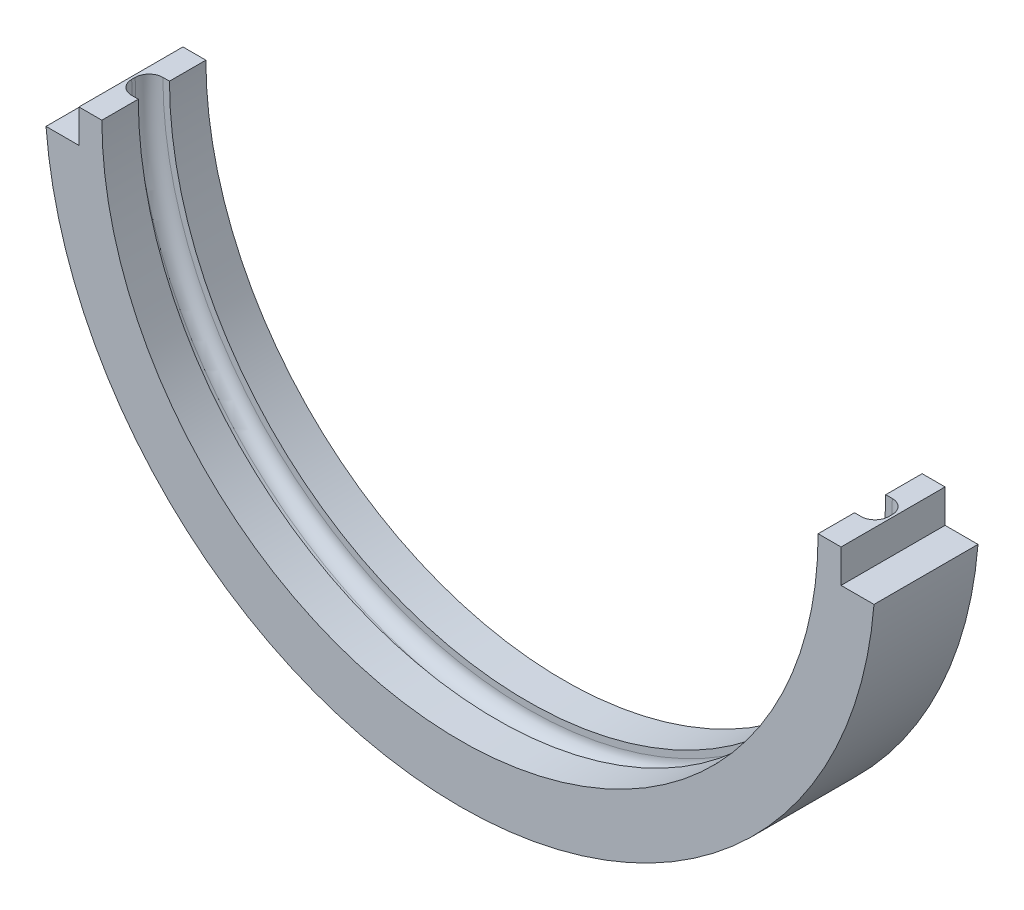
ISO-10303-21;
HEADER;
FILE_DESCRIPTION(('STEP AP214'),'2;1');
FILE_NAME('part.step','',(''),(''),'','','');
FILE_SCHEMA(('AUTOMOTIVE_DESIGN { 1 0 10303 214 1 1 1 1 }'));
ENDSEC;
DATA;
#1=APPLICATION_CONTEXT('core data for automotive mechanical design processes');
#2=APPLICATION_PROTOCOL_DEFINITION('international standard','automotive_design',2000,#1);
#3=PRODUCT_CONTEXT('',#1,'mechanical');
#4=PRODUCT('Part','Part','',(#3));
#5=PRODUCT_RELATED_PRODUCT_CATEGORY('part','',(#4));
#6=PRODUCT_DEFINITION_FORMATION('','',#4);
#7=PRODUCT_DEFINITION_CONTEXT('part definition',#1,'design');
#8=PRODUCT_DEFINITION('design','',#6,#7);
#9=PRODUCT_DEFINITION_SHAPE('','',#8);
#10=(LENGTH_UNIT() NAMED_UNIT(*) SI_UNIT(.MILLI.,.METRE.));
#11=(NAMED_UNIT(*) PLANE_ANGLE_UNIT() SI_UNIT($,.RADIAN.));
#12=(NAMED_UNIT(*) SI_UNIT($,.STERADIAN.) SOLID_ANGLE_UNIT());
#13=UNCERTAINTY_MEASURE_WITH_UNIT(LENGTH_MEASURE(1.E-05),#10,'distance_accuracy_value','');
#14=(GEOMETRIC_REPRESENTATION_CONTEXT(3) GLOBAL_UNCERTAINTY_ASSIGNED_CONTEXT((#13)) GLOBAL_UNIT_ASSIGNED_CONTEXT((#10,
#11,#12)) REPRESENTATION_CONTEXT('',''));
#15=CARTESIAN_POINT('',(0.,0.,0.));
#16=DIRECTION('',(0.,0.,1.));
#17=DIRECTION('',(1.,0.,0.));
#18=AXIS2_PLACEMENT_3D('',#15,#16,#17);
#19=CARTESIAN_POINT('',(0.,76.073,5.715));
#20=DIRECTION('',(0.,0.,-1.));
#21=DIRECTION('',(-1.,0.,0.));
#22=AXIS2_PLACEMENT_3D('',#19,#20,#21);
#23=CYLINDRICAL_SURFACE('',#22,76.073);
#24=CARTESIAN_POINT('',(0.,0.,1.33349999999999));
#25=CARTESIAN_POINT('',(0.0855945349997394,2.06101865915867E-07,1.33350379291589));
#26=CARTESIAN_POINT('',(0.171250915498614,0.000146012248360919,1.34073524768457));
#27=CARTESIAN_POINT('',(0.340204023150751,0.00071364506222568,1.36948225182749));
#28=CARTESIAN_POINT('',(0.423497794593289,0.00113580282824444,1.39101493604841));
#29=CARTESIAN_POINT('',(0.58525356893735,0.00220832220925467,1.44775060002442));
#30=CARTESIAN_POINT('',(0.663717883442069,0.00285857363366933,1.48294697981084));
#31=CARTESIAN_POINT('',(0.813602096244806,0.0043138981059449,1.56600169332678));
#32=CARTESIAN_POINT('',(0.885023725956289,0.00511893295668781,1.61385690423012));
#33=CARTESIAN_POINT('',(1.01883757249064,0.00679340697851409,1.72088761442366));
#34=CARTESIAN_POINT('',(1.08122770917481,0.00766286091714674,1.78006571434437));
#35=CARTESIAN_POINT('',(1.19519031708527,0.0093680471323975,1.90805861859076));
#36=CARTESIAN_POINT('',(1.24676236082598,0.010203778075371,1.97687380355443));
#37=CARTESIAN_POINT('',(1.3376251451231,0.0117473104519163,2.12219141461824));
#38=CARTESIAN_POINT('',(1.37691508154246,0.0124551035078293,2.19869434361906));
#39=CARTESIAN_POINT('',(1.44209293399731,0.0136628632197349,2.35721212766005));
#40=CARTESIAN_POINT('',(1.46798088892473,0.0141628304788274,2.43922696670414));
#41=CARTESIAN_POINT('',(1.50561666142446,0.0148984887564408,2.60642887018513));
#42=CARTESIAN_POINT('',(1.51736637556974,0.0151342152212277,2.69161550756052));
#43=CARTESIAN_POINT('',(1.52639796106279,0.0153149207245114,2.8627524189173));
#44=CARTESIAN_POINT('',(1.52367987260578,0.0152599005707755,2.94870269077645));
#45=CARTESIAN_POINT('',(1.50385466040848,0.0148653504340099,3.11891417148759));
#46=CARTESIAN_POINT('',(1.48674959902126,0.0145258612292591,3.20317562065764));
#47=CARTESIAN_POINT('',(1.43863917290202,0.0136007098296155,3.3676307436008));
#48=CARTESIAN_POINT('',(1.40763378638577,0.0130150472489263,3.44782441099877));
#49=CARTESIAN_POINT('',(1.33260048235792,0.0116635275432489,3.60187411392825));
#50=CARTESIAN_POINT('',(1.28857161888797,0.0108976573297322,3.67572968859041));
#51=CARTESIAN_POINT('',(1.18874191287519,0.00927207813996294,3.81500161578621));
#52=CARTESIAN_POINT('',(1.13294106097371,0.00841236908910922,3.88041796161065));
#53=CARTESIAN_POINT('',(1.01113968026977,0.00669585093085855,4.00096653225274));
#54=CARTESIAN_POINT('',(0.945137359360457,0.0058390423600706,4.05609694636289));
#55=CARTESIAN_POINT('',(0.804812955805773,0.00422506510297776,4.15449474589157));
#56=CARTESIAN_POINT('',(0.730490871968146,0.00346789643095172,4.19776212961007));
#57=CARTESIAN_POINT('',(0.575635722257035,0.00213855432188997,4.27120543008588));
#58=CARTESIAN_POINT('',(0.495102630444092,0.00156638165751761,4.30138129216468));
#59=CARTESIAN_POINT('',(0.330111987568197,0.000671548269268094,4.34778380786271));
#60=CARTESIAN_POINT('',(0.245654441366153,0.000348887236349569,4.3640104787592));
#61=CARTESIAN_POINT('',(0.0752280970382326,-1.05092405947312E-05,4.38205177674906));
#62=CARTESIAN_POINT('',(-0.0107404358431765,-4.72943757394238E-05,4.38386890851823));
#63=CARTESIAN_POINT('',(-0.181762198594427,0.000169076345192388,4.37304606986865));
#64=CARTESIAN_POINT('',(-0.266815428914038,0.000422232058788883,4.36040610655427));
#65=CARTESIAN_POINT('',(-0.433585227687398,0.0011899157446135,4.32102995718912));
#66=CARTESIAN_POINT('',(-0.515302064212906,0.00170442267303155,4.29429490605803));
#67=CARTESIAN_POINT('',(-0.673087615387558,0.00293681524962359,4.22748865692274));
#68=CARTESIAN_POINT('',(-0.749156325373015,0.00365470106572617,4.18741744790695));
#69=CARTESIAN_POINT('',(-0.893497817923817,0.00521306827912535,4.09506991635602));
#70=CARTESIAN_POINT('',(-0.961769521065522,0.00605356661440183,4.04279190694471));
#71=CARTESIAN_POINT('',(-1.08856816644544,0.00776235857443175,3.92751724418561));
#72=CARTESIAN_POINT('',(-1.14709509541133,0.00863065223704034,3.86452057623931));
#73=CARTESIAN_POINT('',(-1.25275113682792,0.0102972860680389,3.72958614285633));
#74=CARTESIAN_POINT('',(-1.2998786325906,0.0110956163038644,3.65764711138529));
#75=CARTESIAN_POINT('',(-1.38138693581098,0.012532160014725,3.50687658683567));
#76=CARTESIAN_POINT('',(-1.41576776354565,0.0131703737444674,3.4280451047216));
#77=CARTESIAN_POINT('',(-1.47080396987324,0.0142146587671107,3.26573353617285));
#78=CARTESIAN_POINT('',(-1.49146040078931,0.0146207478579197,3.18225380667632));
#79=CARTESIAN_POINT('',(-1.51846491163559,0.015155049642882,3.01301030152232));
#80=CARTESIAN_POINT('',(-1.52481298287515,0.0152832621682579,2.92724652447759));
#81=CARTESIAN_POINT('',(-1.5230204201675,0.0152473484650301,2.75588581915875));
#82=CARTESIAN_POINT('',(-1.51488234856612,0.0150832739369008,2.67028886405773));
#83=CARTESIAN_POINT('',(-1.4843537508379,0.0144813917127718,2.50167631198362));
#84=CARTESIAN_POINT('',(-1.46196319621411,0.0140435834694591,2.41866072017216));
#85=CARTESIAN_POINT('',(-1.40356528137836,0.0129435925449101,2.25756570290613));
#86=CARTESIAN_POINT('',(-1.36755767518963,0.0122814058105504,2.17948636664921));
#87=CARTESIAN_POINT('',(-1.28294952090296,0.0108073427394373,2.03048353282782));
#88=CARTESIAN_POINT('',(-1.23434944982934,0.00999547207330576,1.95955976433944));
#89=CARTESIAN_POINT('',(-1.12593166801518,0.00831346202115557,1.82687158382607));
#90=CARTESIAN_POINT('',(-1.06611316687766,0.00744331853229102,1.76510781772051));
#91=CARTESIAN_POINT('',(-0.936938606354715,0.00574266821983038,1.65248329537931));
#92=CARTESIAN_POINT('',(-0.867580184106196,0.00491217128481854,1.60162524830068));
#93=CARTESIAN_POINT('',(-0.721275855637611,0.00338424251398353,1.51225182287018));
#94=CARTESIAN_POINT('',(-0.644325772223447,0.00268688456219293,1.47374328973678));
#95=CARTESIAN_POINT('',(-0.485111216277927,0.00150529078577328,1.41023637854843));
#96=CARTESIAN_POINT('',(-0.402853232344317,0.00102080019868899,1.38522184248434));
#97=CARTESIAN_POINT('',(-0.266727553014035,0.00044943552346389,1.35606306091305));
#98=CARTESIAN_POINT('',(-0.213743956090708,0.000281625570785505,1.34761251136189));
#99=CARTESIAN_POINT('',(-0.10718165758212,5.68432813400188E-05,1.33632979362654));
#100=CARTESIAN_POINT('',(-0.0536029560740152,-1.29069797102052E-07,1.33349762471394));
#101=CARTESIAN_POINT('',(0.,0.,1.33349999999999));
#102=B_SPLINE_CURVE_WITH_KNOTS('',3,(#24,#25,#26,#27,#28,#29,#30,#31,#32,#33,#34,#35,#36,#37,
#38,#39,#40,#41,#42,#43,#44,#45,#46,#47,#48,#49,#50,#51,#52,#53,#54,#55,#56,#57,#58,#59,#60,#61,
#62,#63,#64,#65,#66,#67,#68,#69,#70,#71,#72,#73,#74,#75,#76,#77,#78,#79,#80,#81,#82,#83,#84,#85,
#86,#87,#88,#89,#90,#91,#92,#93,#94,#95,#96,#97,#98,#99,#100,#101),.UNSPECIFIED.,.T.,.F.,(4,2,2,
2,2,2,2,2,2,2,2,2,2,2,2,2,2,2,2,2,2,2,2,2,2,2,2,2,2,2,2,2,2,2,2,2,2,2,4),(0.,0.256587951195914,
0.513483886104433,0.770255886772825,1.02696460294593,1.28373235066598,1.5405102428578,
1.79730494335351,2.0540988986388,2.31085840248152,2.56761719298187,2.82433918372928,
3.08106157680606,3.33780262145724,3.59454387021671,3.85133027245316,4.10811671148822,
4.36490422301619,4.62169141649049,4.87843397406325,5.13517640547004,5.3918981674388,
5.64862014138162,5.90537761313974,6.16213543459716,6.41892964858623,6.67572345407407,
6.9324975675299,7.18927183694585,7.44600069198828,7.70273006034533,7.95946406645213,
8.21618834845273,8.47293072481965,8.72973680644864,8.98668498820558,9.2433248077216,
9.40401117000277,9.56469751145107),.UNSPECIFIED.);
#103=CARTESIAN_POINT('',(0.,0.,1.33349999999999));
#104=VERTEX_POINT('',#103);
#105=EDGE_CURVE('E234',#104,#104,#102,.T.);
#106=ORIENTED_EDGE('',*,*,#105,.F.);
#107=EDGE_LOOP('',(#106));
#108=FACE_BOUND('',#107,.T.);
#109=DIRECTION('',(0.,0.,1.));
#110=VECTOR('',#109,1.);
#111=CARTESIAN_POINT('',(-75.8283595563032,69.9769999999999,-6.6675));
#112=LINE('',#111,#110);
#113=CARTESIAN_POINT('',(-75.8283595563032,69.9769999999999,-6.6675));
#114=VERTEX_POINT('',#113);
#115=CARTESIAN_POINT('',(-75.8283595563032,69.9769999999999,12.3825));
#116=VERTEX_POINT('',#115);
#117=EDGE_CURVE('E12',#114,#116,#112,.T.);
#118=ORIENTED_EDGE('',*,*,#117,.F.);
#119=CARTESIAN_POINT('',(0.,76.073,-6.6675));
#120=DIRECTION('',(0.,0.,-1.));
#121=DIRECTION('',(-1.,0.,0.));
#122=AXIS2_PLACEMENT_3D('',#119,#120,#121);
#123=CIRCLE('',#122,76.073);
#124=CARTESIAN_POINT('',(75.8283595563032,69.977,-6.6675));
#125=VERTEX_POINT('',#124);
#126=EDGE_CURVE('E303',#125,#114,#123,.T.);
#127=ORIENTED_EDGE('',*,*,#126,.F.);
#128=DIRECTION('',(0.,0.,-1.));
#129=VECTOR('',#128,1.);
#130=CARTESIAN_POINT('',(75.8283595563032,69.977,5.715));
#131=LINE('',#130,#129);
#132=CARTESIAN_POINT('',(75.8283595563032,69.977,12.3825));
#133=VERTEX_POINT('',#132);
#134=EDGE_CURVE('E202',#125,#133,#131,.F.);
#135=ORIENTED_EDGE('',*,*,#134,.T.);
#136=CARTESIAN_POINT('',(0.,76.073,12.3825));
#137=DIRECTION('',(0.,0.,1.));
#138=DIRECTION('',(1.,0.,0.));
#139=AXIS2_PLACEMENT_3D('',#136,#137,#138);
#140=CIRCLE('',#139,76.073);
#141=EDGE_CURVE('E305',#116,#133,#140,.T.);
#142=ORIENTED_EDGE('',*,*,#141,.F.);
#143=EDGE_LOOP('',(#118,#127,#135,#142));
#144=FACE_BOUND('',#143,.T.);
#145=ADVANCED_FACE('F90',(#108,#144),#23,.T.);
#146=CARTESIAN_POINT('',(0.,76.073,5.715));
#147=DIRECTION('',(0.,-1.,0.));
#148=DIRECTION('',(0.,0.,-1.));
#149=AXIS2_PLACEMENT_3D('',#146,#147,#148);
#150=PLANE('',#149);
#151=DIRECTION('',(0.,0.,1.));
#152=VECTOR('',#151,1.);
#153=CARTESIAN_POINT('',(-69.7958595563032,76.073,-6.6675));
#154=LINE('',#153,#152);
#155=CARTESIAN_POINT('',(-69.7958595563032,76.073,-6.6675));
#156=VERTEX_POINT('',#155);
#157=CARTESIAN_POINT('',(-69.7958595563032,76.073,12.3825));
#158=VERTEX_POINT('',#157);
#159=EDGE_CURVE('E191',#156,#158,#154,.T.);
#160=ORIENTED_EDGE('',*,*,#159,.T.);
#161=DIRECTION('',(-1.,0.,0.));
#162=VECTOR('',#161,1.);
#163=CARTESIAN_POINT('',(0.,76.073,12.3825));
#164=LINE('',#163,#162);
#165=CARTESIAN_POINT('',(-65.5955,76.073,12.3825));
#166=VERTEX_POINT('',#165);
#167=EDGE_CURVE('E218',#166,#158,#164,.T.);
#168=ORIENTED_EDGE('',*,*,#167,.F.);
#169=DIRECTION('',(0.,0.,-1.));
#170=VECTOR('',#169,1.);
#171=CARTESIAN_POINT('',(-65.5955,76.073,12.3825));
#172=LINE('',#171,#170);
#173=CARTESIAN_POINT('',(-65.5955,76.073,5.715));
#174=VERTEX_POINT('',#173);
#175=EDGE_CURVE('E201',#166,#174,#172,.T.);
#176=ORIENTED_EDGE('',*,*,#175,.T.);
#177=DIRECTION('',(-1.,0.,0.));
#178=VECTOR('',#177,1.);
#179=CARTESIAN_POINT('',(0.,76.073,5.715));
#180=LINE('',#179,#178);
#181=CARTESIAN_POINT('',(-66.802,76.073,5.715));
#182=VERTEX_POINT('',#181);
#183=EDGE_CURVE('E342',#174,#182,#180,.T.);
#184=ORIENTED_EDGE('',*,*,#183,.T.);
#185=CARTESIAN_POINT('',(-66.802,76.073,3.175));
#186=DIRECTION('',(0.,-1.,0.));
#187=DIRECTION('',(0.,0.,-1.));
#188=AXIS2_PLACEMENT_3D('',#185,#186,#187);
#189=CIRCLE('',#188,2.54);
#190=CARTESIAN_POINT('',(-69.342,76.073,3.175));
#191=VERTEX_POINT('',#190);
#192=EDGE_CURVE('E228',#182,#191,#189,.T.);
#193=ORIENTED_EDGE('',*,*,#192,.T.);
#194=DIRECTION('',(0.,0.,-1.));
#195=VECTOR('',#194,1.);
#196=CARTESIAN_POINT('',(-69.342,76.073,5.715));
#197=LINE('',#196,#195);
#198=CARTESIAN_POINT('',(-69.342,76.073,2.54));
#199=VERTEX_POINT('',#198);
#200=EDGE_CURVE('E222',#191,#199,#197,.T.);
#201=ORIENTED_EDGE('',*,*,#200,.T.);
#202=CARTESIAN_POINT('',(-66.802,76.073,2.54));
#203=DIRECTION('',(0.,-1.,0.));
#204=DIRECTION('',(0.,0.,-1.));
#205=AXIS2_PLACEMENT_3D('',#202,#203,#204);
#206=CIRCLE('',#205,2.54);
#207=CARTESIAN_POINT('',(-66.802,76.073,0.));
#208=VERTEX_POINT('',#207);
#209=EDGE_CURVE('E219',#199,#208,#206,.T.);
#210=ORIENTED_EDGE('',*,*,#209,.T.);
#211=DIRECTION('',(-1.,0.,0.));
#212=VECTOR('',#211,1.);
#213=CARTESIAN_POINT('',(0.,76.073,0.));
#214=LINE('',#213,#212);
#215=CARTESIAN_POINT('',(-65.5955,76.073,0.));
#216=VERTEX_POINT('',#215);
#217=EDGE_CURVE('E369',#216,#208,#214,.T.);
#218=ORIENTED_EDGE('',*,*,#217,.F.);
#219=DIRECTION('',(0.,0.,1.));
#220=VECTOR('',#219,1.);
#221=CARTESIAN_POINT('',(-65.5955,76.073,-6.6675));
#222=LINE('',#221,#220);
#223=CARTESIAN_POINT('',(-65.5955,76.073,-6.6675));
#224=VERTEX_POINT('',#223);
#225=EDGE_CURVE('E215',#224,#216,#222,.T.);
#226=ORIENTED_EDGE('',*,*,#225,.F.);
#227=DIRECTION('',(-1.,0.,0.));
#228=VECTOR('',#227,1.);
#229=CARTESIAN_POINT('',(0.,76.073,-6.6675));
#230=LINE('',#229,#228);
#231=EDGE_CURVE('E94',#224,#156,#230,.T.);
#232=ORIENTED_EDGE('',*,*,#231,.T.);
#233=EDGE_LOOP('',(#160,#168,#176,#184,#193,#201,#210,#218,#226,#232));
#234=FACE_BOUND('',#233,.T.);
#235=ADVANCED_FACE('F213',(#234),#150,.F.);
#236=CARTESIAN_POINT('',(0.,0.,12.3825));
#237=DIRECTION('',(0.,0.,1.));
#238=DIRECTION('',(1.,0.,0.));
#239=AXIS2_PLACEMENT_3D('',#236,#237,#238);
#240=PLANE('',#239);
#241=ORIENTED_EDGE('',*,*,#167,.T.);
#242=DIRECTION('',(0.,-1.,0.));
#243=VECTOR('',#242,1.);
#244=CARTESIAN_POINT('',(-69.7958595563032,0.,12.3825));
#245=LINE('',#244,#243);
#246=CARTESIAN_POINT('',(-69.7958595563032,69.9769999999999,12.3825));
#247=VERTEX_POINT('',#246);
#248=EDGE_CURVE('E188',#158,#247,#245,.T.);
#249=ORIENTED_EDGE('',*,*,#248,.T.);
#250=DIRECTION('',(-1.,0.,0.));
#251=VECTOR('',#250,1.);
#252=CARTESIAN_POINT('',(0.,69.9769999999999,12.3825));
#253=LINE('',#252,#251);
#254=EDGE_CURVE('E323',#247,#116,#253,.T.);
#255=ORIENTED_EDGE('',*,*,#254,.T.);
#256=ORIENTED_EDGE('',*,*,#141,.T.);
#257=DIRECTION('',(1.,0.,0.));
#258=VECTOR('',#257,1.);
#259=CARTESIAN_POINT('',(0.,69.977,12.3825));
#260=LINE('',#259,#258);
#261=CARTESIAN_POINT('',(69.7958595563032,69.977,12.3825));
#262=VERTEX_POINT('',#261);
#263=EDGE_CURVE('E419',#262,#133,#260,.T.);
#264=ORIENTED_EDGE('',*,*,#263,.F.);
#265=DIRECTION('',(0.,-1.,0.));
#266=VECTOR('',#265,1.);
#267=CARTESIAN_POINT('',(69.7958595563032,0.,12.3825));
#268=LINE('',#267,#266);
#269=CARTESIAN_POINT('',(69.7958595563032,76.073,12.3825));
#270=VERTEX_POINT('',#269);
#271=EDGE_CURVE('E242',#270,#262,#268,.T.);
#272=ORIENTED_EDGE('',*,*,#271,.F.);
#273=DIRECTION('',(1.,0.,0.));
#274=VECTOR('',#273,1.);
#275=CARTESIAN_POINT('',(0.,76.073,12.3825));
#276=LINE('',#275,#274);
#277=CARTESIAN_POINT('',(65.5955,76.073,12.3825));
#278=VERTEX_POINT('',#277);
#279=EDGE_CURVE('E367',#278,#270,#276,.T.);
#280=ORIENTED_EDGE('',*,*,#279,.F.);
#281=CARTESIAN_POINT('',(0.,76.073,12.3825));
#282=DIRECTION('',(0.,0.,1.));
#283=DIRECTION('',(1.,0.,0.));
#284=AXIS2_PLACEMENT_3D('',#281,#282,#283);
#285=CIRCLE('',#284,65.5955);
#286=EDGE_CURVE('E339',#166,#278,#285,.T.);
#287=ORIENTED_EDGE('',*,*,#286,.F.);
#288=EDGE_LOOP('',(#241,#249,#255,#256,#264,#272,#280,#287));
#289=FACE_BOUND('',#288,.T.);
#290=ADVANCED_FACE('F289',(#289),#240,.T.);
#291=CARTESIAN_POINT('',(0.,0.,-6.6675));
#292=DIRECTION('',(0.,0.,-1.));
#293=DIRECTION('',(-1.,0.,0.));
#294=AXIS2_PLACEMENT_3D('',#291,#292,#293);
#295=PLANE('',#294);
#296=DIRECTION('',(-1.,0.,0.));
#297=VECTOR('',#296,1.);
#298=CARTESIAN_POINT('',(0.,69.9769999999999,-6.6675));
#299=LINE('',#298,#297);
#300=CARTESIAN_POINT('',(-69.7958595563032,69.9769999999999,-6.6675));
#301=VERTEX_POINT('',#300);
#302=EDGE_CURVE('E101',#301,#114,#299,.T.);
#303=ORIENTED_EDGE('',*,*,#302,.F.);
#304=DIRECTION('',(0.,-1.,0.));
#305=VECTOR('',#304,1.);
#306=CARTESIAN_POINT('',(-69.7958595563032,0.,-6.6675));
#307=LINE('',#306,#305);
#308=EDGE_CURVE('E194',#156,#301,#307,.T.);
#309=ORIENTED_EDGE('',*,*,#308,.F.);
#310=ORIENTED_EDGE('',*,*,#231,.F.);
#311=CARTESIAN_POINT('',(0.,76.073,-6.6675));
#312=DIRECTION('',(0.,0.,-1.));
#313=DIRECTION('',(-1.,0.,0.));
#314=AXIS2_PLACEMENT_3D('',#311,#312,#313);
#315=CIRCLE('',#314,65.5955);
#316=CARTESIAN_POINT('',(65.5955,76.073,-6.6675));
#317=VERTEX_POINT('',#316);
#318=EDGE_CURVE('E409',#317,#224,#315,.T.);
#319=ORIENTED_EDGE('',*,*,#318,.F.);
#320=DIRECTION('',(1.,0.,0.));
#321=VECTOR('',#320,1.);
#322=CARTESIAN_POINT('',(0.,76.073,-6.6675));
#323=LINE('',#322,#321);
#324=CARTESIAN_POINT('',(69.7958595563032,76.073,-6.6675));
#325=VERTEX_POINT('',#324);
#326=EDGE_CURVE('E322',#317,#325,#323,.T.);
#327=ORIENTED_EDGE('',*,*,#326,.T.);
#328=DIRECTION('',(0.,-1.,0.));
#329=VECTOR('',#328,1.);
#330=CARTESIAN_POINT('',(69.7958595563032,0.,-6.6675));
#331=LINE('',#330,#329);
#332=CARTESIAN_POINT('',(69.7958595563032,69.977,-6.6675));
#333=VERTEX_POINT('',#332);
#334=EDGE_CURVE('E317',#325,#333,#331,.T.);
#335=ORIENTED_EDGE('',*,*,#334,.T.);
#336=DIRECTION('',(1.,0.,0.));
#337=VECTOR('',#336,1.);
#338=CARTESIAN_POINT('',(0.,69.977,-6.6675));
#339=LINE('',#338,#337);
#340=EDGE_CURVE('E308',#333,#125,#339,.T.);
#341=ORIENTED_EDGE('',*,*,#340,.T.);
#342=ORIENTED_EDGE('',*,*,#126,.T.);
#343=EDGE_LOOP('',(#303,#309,#310,#319,#327,#335,#341,#342));
#344=FACE_BOUND('',#343,.T.);
#345=ADVANCED_FACE('F206',(#344),#295,.T.);
#346=CARTESIAN_POINT('',(0.,76.073,5.715));
#347=DIRECTION('',(0.,0.,-1.));
#348=DIRECTION('',(-1.,0.,0.));
#349=AXIS2_PLACEMENT_3D('',#346,#347,#348);
#350=CYLINDRICAL_SURFACE('',#349,69.342);
#351=ORIENTED_EDGE('',*,*,#200,.F.);
#352=CARTESIAN_POINT('',(0.,76.073,3.175));
#353=DIRECTION('',(0.,0.,1.));
#354=DIRECTION('',(1.,0.,0.));
#355=AXIS2_PLACEMENT_3D('',#352,#353,#354);
#356=CIRCLE('',#355,69.342);
#357=CARTESIAN_POINT('',(69.342,76.073,3.175));
#358=VERTEX_POINT('',#357);
#359=EDGE_CURVE('E310',#191,#358,#356,.T.);
#360=ORIENTED_EDGE('',*,*,#359,.T.);
#361=DIRECTION('',(0.,0.,-1.));
#362=VECTOR('',#361,1.);
#363=CARTESIAN_POINT('',(69.342,76.073,5.715));
#364=LINE('',#363,#362);
#365=CARTESIAN_POINT('',(69.342,76.073,2.54));
#366=VERTEX_POINT('',#365);
#367=EDGE_CURVE('E315',#358,#366,#364,.T.);
#368=ORIENTED_EDGE('',*,*,#367,.T.);
#369=CARTESIAN_POINT('',(0.,76.073,2.54));
#370=DIRECTION('',(0.,0.,-1.));
#371=DIRECTION('',(-1.,0.,0.));
#372=AXIS2_PLACEMENT_3D('',#369,#370,#371);
#373=CIRCLE('',#372,69.342);
#374=EDGE_CURVE('E373',#366,#199,#373,.T.);
#375=ORIENTED_EDGE('',*,*,#374,.T.);
#376=EDGE_LOOP('',(#351,#360,#368,#375));
#377=FACE_BOUND('',#376,.T.);
#378=ADVANCED_FACE('F271',(#377),#350,.F.);
#379=CARTESIAN_POINT('',(0.,76.073,5.715));
#380=DIRECTION('',(0.,1.,0.));
#381=DIRECTION('',(0.,0.,1.));
#382=AXIS2_PLACEMENT_3D('',#379,#380,#381);
#383=PLANE('',#382);
#384=DIRECTION('',(0.,0.,1.));
#385=VECTOR('',#384,1.);
#386=CARTESIAN_POINT('',(69.7958595563032,76.073,-6.6675));
#387=LINE('',#386,#385);
#388=EDGE_CURVE('E416',#325,#270,#387,.T.);
#389=ORIENTED_EDGE('',*,*,#388,.F.);
#390=ORIENTED_EDGE('',*,*,#326,.F.);
#391=DIRECTION('',(0.,0.,1.));
#392=VECTOR('',#391,1.);
#393=CARTESIAN_POINT('',(65.5955,76.073,-6.6675));
#394=LINE('',#393,#392);
#395=CARTESIAN_POINT('',(65.5955,76.073,0.));
#396=VERTEX_POINT('',#395);
#397=EDGE_CURVE('E376',#317,#396,#394,.T.);
#398=ORIENTED_EDGE('',*,*,#397,.T.);
#399=DIRECTION('',(1.,0.,0.));
#400=VECTOR('',#399,1.);
#401=CARTESIAN_POINT('',(0.,76.073,0.));
#402=LINE('',#401,#400);
#403=CARTESIAN_POINT('',(66.802,76.073,0.));
#404=VERTEX_POINT('',#403);
#405=EDGE_CURVE('E396',#396,#404,#402,.T.);
#406=ORIENTED_EDGE('',*,*,#405,.T.);
#407=CARTESIAN_POINT('',(66.802,76.073,2.54));
#408=DIRECTION('',(0.,1.,0.));
#409=DIRECTION('',(0.,0.,1.));
#410=AXIS2_PLACEMENT_3D('',#407,#408,#409);
#411=CIRCLE('',#410,2.54);
#412=EDGE_CURVE('E232',#404,#366,#411,.F.);
#413=ORIENTED_EDGE('',*,*,#412,.T.);
#414=ORIENTED_EDGE('',*,*,#367,.F.);
#415=CARTESIAN_POINT('',(66.802,76.073,3.175));
#416=DIRECTION('',(0.,1.,0.));
#417=DIRECTION('',(0.,0.,1.));
#418=AXIS2_PLACEMENT_3D('',#415,#416,#417);
#419=CIRCLE('',#418,2.54);
#420=CARTESIAN_POINT('',(66.802,76.073,5.715));
#421=VERTEX_POINT('',#420);
#422=EDGE_CURVE('E383',#358,#421,#419,.F.);
#423=ORIENTED_EDGE('',*,*,#422,.T.);
#424=DIRECTION('',(1.,0.,0.));
#425=VECTOR('',#424,1.);
#426=CARTESIAN_POINT('',(0.,76.073,5.715));
#427=LINE('',#426,#425);
#428=CARTESIAN_POINT('',(65.5955,76.073,5.715));
#429=VERTEX_POINT('',#428);
#430=EDGE_CURVE('E361',#429,#421,#427,.T.);
#431=ORIENTED_EDGE('',*,*,#430,.F.);
#432=DIRECTION('',(0.,0.,-1.));
#433=VECTOR('',#432,1.);
#434=CARTESIAN_POINT('',(65.5955,76.073,12.3825));
#435=LINE('',#434,#433);
#436=EDGE_CURVE('E355',#278,#429,#435,.T.);
#437=ORIENTED_EDGE('',*,*,#436,.F.);
#438=ORIENTED_EDGE('',*,*,#279,.T.);
#439=EDGE_LOOP('',(#389,#390,#398,#406,#413,#414,#423,#431,#437,#438));
#440=FACE_BOUND('',#439,.T.);
#441=ADVANCED_FACE('F266',(#440),#383,.T.);
#442=CARTESIAN_POINT('',(0.,0.,5.715));
#443=DIRECTION('',(0.,0.,1.));
#444=DIRECTION('',(1.,0.,0.));
#445=AXIS2_PLACEMENT_3D('',#442,#443,#444);
#446=PLANE('',#445);
#447=ORIENTED_EDGE('',*,*,#430,.T.);
#448=CARTESIAN_POINT('',(0.,76.073,5.715));
#449=DIRECTION('',(0.,0.,1.));
#450=DIRECTION('',(1.,0.,0.));
#451=AXIS2_PLACEMENT_3D('',#448,#449,#450);
#452=CIRCLE('',#451,66.802);
#453=EDGE_CURVE('E352',#421,#182,#452,.F.);
#454=ORIENTED_EDGE('',*,*,#453,.T.);
#455=ORIENTED_EDGE('',*,*,#183,.F.);
#456=CARTESIAN_POINT('',(0.,76.073,5.715));
#457=DIRECTION('',(0.,0.,1.));
#458=DIRECTION('',(1.,0.,0.));
#459=AXIS2_PLACEMENT_3D('',#456,#457,#458);
#460=CIRCLE('',#459,65.5955);
#461=EDGE_CURVE('E349',#174,#429,#460,.T.);
#462=ORIENTED_EDGE('',*,*,#461,.T.);
#463=EDGE_LOOP('',(#447,#454,#455,#462));
#464=FACE_BOUND('',#463,.T.);
#465=ADVANCED_FACE('F263',(#464),#446,.F.);
#466=CARTESIAN_POINT('',(0.,76.073,12.3825));
#467=DIRECTION('',(0.,0.,-1.));
#468=DIRECTION('',(-1.,0.,0.));
#469=AXIS2_PLACEMENT_3D('',#466,#467,#468);
#470=CYLINDRICAL_SURFACE('',#469,65.5955);
#471=ORIENTED_EDGE('',*,*,#461,.F.);
#472=ORIENTED_EDGE('',*,*,#175,.F.);
#473=ORIENTED_EDGE('',*,*,#286,.T.);
#474=ORIENTED_EDGE('',*,*,#436,.T.);
#475=EDGE_LOOP('',(#471,#472,#473,#474));
#476=FACE_BOUND('',#475,.T.);
#477=ADVANCED_FACE('F257',(#476),#470,.F.);
#478=CARTESIAN_POINT('',(0.,0.,0.));
#479=DIRECTION('',(0.,0.,-1.));
#480=DIRECTION('',(-1.,0.,0.));
#481=AXIS2_PLACEMENT_3D('',#478,#479,#480);
#482=PLANE('',#481);
#483=ORIENTED_EDGE('',*,*,#217,.T.);
#484=CARTESIAN_POINT('',(0.,76.073,0.));
#485=DIRECTION('',(0.,0.,-1.));
#486=DIRECTION('',(-1.,0.,0.));
#487=AXIS2_PLACEMENT_3D('',#484,#485,#486);
#488=CIRCLE('',#487,66.802);
#489=EDGE_CURVE('E378',#208,#404,#488,.F.);
#490=ORIENTED_EDGE('',*,*,#489,.T.);
#491=ORIENTED_EDGE('',*,*,#405,.F.);
#492=CARTESIAN_POINT('',(0.,76.073,0.));
#493=DIRECTION('',(0.,0.,-1.));
#494=DIRECTION('',(-1.,0.,0.));
#495=AXIS2_PLACEMENT_3D('',#492,#493,#494);
#496=CIRCLE('',#495,65.5955);
#497=EDGE_CURVE('E382',#396,#216,#496,.T.);
#498=ORIENTED_EDGE('',*,*,#497,.T.);
#499=EDGE_LOOP('',(#483,#490,#491,#498));
#500=FACE_BOUND('',#499,.T.);
#501=ADVANCED_FACE('F253',(#500),#482,.F.);
#502=CARTESIAN_POINT('',(0.,76.073,-6.6675));
#503=DIRECTION('',(0.,0.,1.));
#504=DIRECTION('',(1.,0.,0.));
#505=AXIS2_PLACEMENT_3D('',#502,#503,#504);
#506=CYLINDRICAL_SURFACE('',#505,65.5955);
#507=ORIENTED_EDGE('',*,*,#497,.F.);
#508=ORIENTED_EDGE('',*,*,#397,.F.);
#509=ORIENTED_EDGE('',*,*,#318,.T.);
#510=ORIENTED_EDGE('',*,*,#225,.T.);
#511=EDGE_LOOP('',(#507,#508,#509,#510));
#512=FACE_BOUND('',#511,.T.);
#513=ADVANCED_FACE('F256',(#512),#506,.F.);
#514=CARTESIAN_POINT('',(0.,76.073,3.175));
#515=DIRECTION('',(0.,0.,1.));
#516=DIRECTION('',(1.,0.,0.));
#517=AXIS2_PLACEMENT_3D('',#514,#515,#516);
#518=TOROIDAL_SURFACE('',#517,66.802,2.54);
#519=ORIENTED_EDGE('',*,*,#192,.F.);
#520=ORIENTED_EDGE('',*,*,#453,.F.);
#521=ORIENTED_EDGE('',*,*,#422,.F.);
#522=ORIENTED_EDGE('',*,*,#359,.F.);
#523=EDGE_LOOP('',(#519,#520,#521,#522));
#524=FACE_BOUND('',#523,.T.);
#525=ADVANCED_FACE('F261',(#524),#518,.F.);
#526=CARTESIAN_POINT('',(0.,76.073,2.54));
#527=DIRECTION('',(0.,0.,-1.));
#528=DIRECTION('',(-1.,0.,0.));
#529=AXIS2_PLACEMENT_3D('',#526,#527,#528);
#530=TOROIDAL_SURFACE('',#529,66.802,2.54);
#531=ORIENTED_EDGE('',*,*,#209,.F.);
#532=ORIENTED_EDGE('',*,*,#374,.F.);
#533=ORIENTED_EDGE('',*,*,#412,.F.);
#534=ORIENTED_EDGE('',*,*,#489,.F.);
#535=EDGE_LOOP('',(#531,#532,#533,#534));
#536=FACE_BOUND('',#535,.T.);
#537=ADVANCED_FACE('F250',(#536),#530,.F.);
#538=CARTESIAN_POINT('',(0.,6.35,2.85749999999999));
#539=DIRECTION('',(0.,-1.,0.));
#540=DIRECTION('',(0.,0.,-1.));
#541=AXIS2_PLACEMENT_3D('',#538,#539,#540);
#542=CYLINDRICAL_SURFACE('',#541,1.524);
#543=CARTESIAN_POINT('',(0.,6.35,2.85749999999999));
#544=DIRECTION('',(0.,1.,0.));
#545=DIRECTION('',(0.,0.,1.));
#546=AXIS2_PLACEMENT_3D('',#543,#544,#545);
#547=CIRCLE('',#546,1.524);
#548=CARTESIAN_POINT('',(0.,6.35,4.38149999999999));
#549=VERTEX_POINT('',#548);
#550=EDGE_CURVE('E243',#549,#549,#547,.T.);
#551=ORIENTED_EDGE('',*,*,#550,.T.);
#552=EDGE_LOOP('',(#551));
#553=FACE_BOUND('',#552,.T.);
#554=ORIENTED_EDGE('',*,*,#105,.T.);
#555=EDGE_LOOP('',(#554));
#556=FACE_BOUND('',#555,.T.);
#557=ADVANCED_FACE('F244',(#553,#556),#542,.F.);
#558=CARTESIAN_POINT('',(0.,6.35,2.85749999999999));
#559=DIRECTION('',(0.,1.,0.));
#560=DIRECTION('',(0.,0.,1.));
#561=AXIS2_PLACEMENT_3D('',#558,#559,#560);
#562=PLANE('',#561);
#563=ORIENTED_EDGE('',*,*,#550,.F.);
#564=EDGE_LOOP('',(#563));
#565=FACE_BOUND('',#564,.T.);
#566=ADVANCED_FACE('F249',(#565),#562,.F.);
#567=CARTESIAN_POINT('',(69.7958595563032,0.,-6.6675));
#568=DIRECTION('',(-1.,0.,0.));
#569=DIRECTION('',(0.,0.,1.));
#570=AXIS2_PLACEMENT_3D('',#567,#568,#569);
#571=PLANE('',#570);
#572=ORIENTED_EDGE('',*,*,#271,.T.);
#573=DIRECTION('',(0.,0.,1.));
#574=VECTOR('',#573,1.);
#575=CARTESIAN_POINT('',(69.7958595563032,69.977,-6.6675));
#576=LINE('',#575,#574);
#577=EDGE_CURVE('E211',#333,#262,#576,.T.);
#578=ORIENTED_EDGE('',*,*,#577,.F.);
#579=ORIENTED_EDGE('',*,*,#334,.F.);
#580=ORIENTED_EDGE('',*,*,#388,.T.);
#581=EDGE_LOOP('',(#572,#578,#579,#580));
#582=FACE_BOUND('',#581,.T.);
#583=ADVANCED_FACE('F434',(#582),#571,.F.);
#584=CARTESIAN_POINT('',(0.,69.977,-6.6675));
#585=DIRECTION('',(0.,-1.,0.));
#586=DIRECTION('',(0.,0.,-1.));
#587=AXIS2_PLACEMENT_3D('',#584,#585,#586);
#588=PLANE('',#587);
#589=ORIENTED_EDGE('',*,*,#263,.T.);
#590=ORIENTED_EDGE('',*,*,#134,.F.);
#591=ORIENTED_EDGE('',*,*,#340,.F.);
#592=ORIENTED_EDGE('',*,*,#577,.T.);
#593=EDGE_LOOP('',(#589,#590,#591,#592));
#594=FACE_BOUND('',#593,.T.);
#595=ADVANCED_FACE('F284',(#594),#588,.F.);
#596=CARTESIAN_POINT('',(-69.7958595563032,0.,-6.6675));
#597=DIRECTION('',(-1.,0.,0.));
#598=DIRECTION('',(0.,0.,1.));
#599=AXIS2_PLACEMENT_3D('',#596,#597,#598);
#600=PLANE('',#599);
#601=ORIENTED_EDGE('',*,*,#248,.F.);
#602=ORIENTED_EDGE('',*,*,#159,.F.);
#603=ORIENTED_EDGE('',*,*,#308,.T.);
#604=DIRECTION('',(0.,0.,1.));
#605=VECTOR('',#604,1.);
#606=CARTESIAN_POINT('',(-69.7958595563032,69.9769999999999,-6.6675));
#607=LINE('',#606,#605);
#608=EDGE_CURVE('E210',#301,#247,#607,.T.);
#609=ORIENTED_EDGE('',*,*,#608,.T.);
#610=EDGE_LOOP('',(#601,#602,#603,#609));
#611=FACE_BOUND('',#610,.T.);
#612=ADVANCED_FACE('F193',(#611),#600,.T.);
#613=CARTESIAN_POINT('',(0.,69.9769999999999,-6.6675));
#614=DIRECTION('',(0.,1.,0.));
#615=DIRECTION('',(0.,0.,1.));
#616=AXIS2_PLACEMENT_3D('',#613,#614,#615);
#617=PLANE('',#616);
#618=ORIENTED_EDGE('',*,*,#254,.F.);
#619=ORIENTED_EDGE('',*,*,#608,.F.);
#620=ORIENTED_EDGE('',*,*,#302,.T.);
#621=ORIENTED_EDGE('',*,*,#117,.T.);
#622=EDGE_LOOP('',(#618,#619,#620,#621));
#623=FACE_BOUND('',#622,.T.);
#624=ADVANCED_FACE('F283',(#623),#617,.T.);
#625=CLOSED_SHELL('',(#145,#235,#290,#345,#378,#441,#465,#477,#501,#513,#525,#537,#557,#566,
#583,#595,#612,#624));
#626=MANIFOLD_SOLID_BREP('B2',#625);
#627=ADVANCED_BREP_SHAPE_REPRESENTATION('',(#18,#626),#14);
#628=SHAPE_DEFINITION_REPRESENTATION(#9,#627);
ENDSEC;
END-ISO-10303-21;
